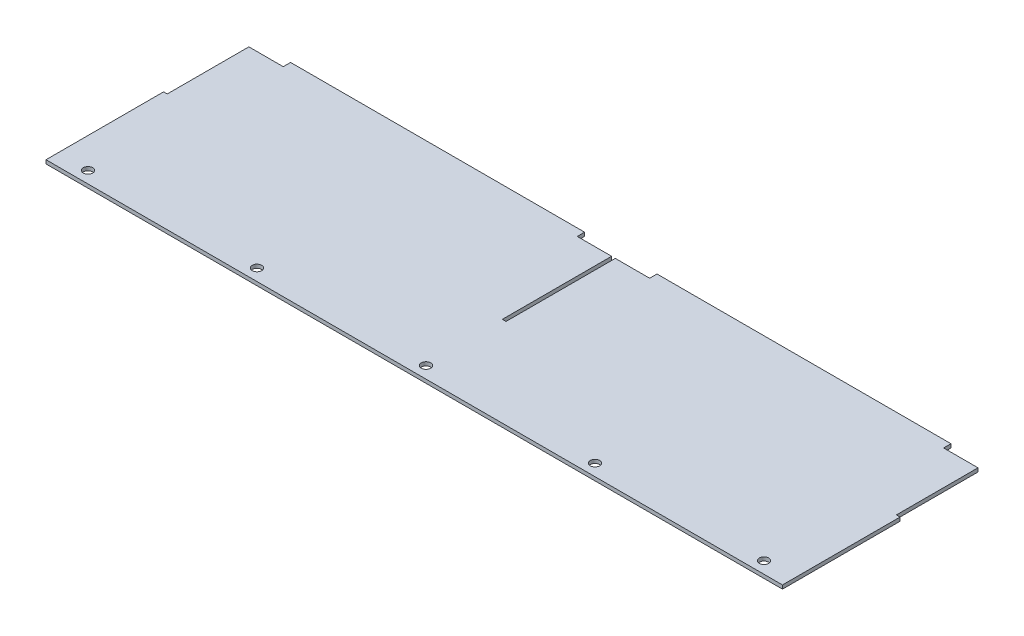
ISO-10303-21;
HEADER;
FILE_DESCRIPTION(('STEP AP214'),'2;1');
FILE_NAME('part.step','',(''),(''),'','','');
FILE_SCHEMA(('AUTOMOTIVE_DESIGN { 1 0 10303 214 1 1 1 1 }'));
ENDSEC;
DATA;
#1=APPLICATION_CONTEXT('core data for automotive mechanical design processes');
#2=APPLICATION_PROTOCOL_DEFINITION('international standard','automotive_design',2000,#1);
#3=PRODUCT_CONTEXT('',#1,'mechanical');
#4=PRODUCT('Part','Part','',(#3));
#5=PRODUCT_RELATED_PRODUCT_CATEGORY('part','',(#4));
#6=PRODUCT_DEFINITION_FORMATION('','',#4);
#7=PRODUCT_DEFINITION_CONTEXT('part definition',#1,'design');
#8=PRODUCT_DEFINITION('design','',#6,#7);
#9=PRODUCT_DEFINITION_SHAPE('','',#8);
#10=(LENGTH_UNIT() NAMED_UNIT(*) SI_UNIT(.MILLI.,.METRE.));
#11=(NAMED_UNIT(*) PLANE_ANGLE_UNIT() SI_UNIT($,.RADIAN.));
#12=(NAMED_UNIT(*) SI_UNIT($,.STERADIAN.) SOLID_ANGLE_UNIT());
#13=UNCERTAINTY_MEASURE_WITH_UNIT(LENGTH_MEASURE(1.E-05),#10,'distance_accuracy_value','');
#14=(GEOMETRIC_REPRESENTATION_CONTEXT(3) GLOBAL_UNCERTAINTY_ASSIGNED_CONTEXT((#13)) GLOBAL_UNIT_ASSIGNED_CONTEXT((#10,
#11,#12)) REPRESENTATION_CONTEXT('',''));
#15=CARTESIAN_POINT('',(0.,0.,0.));
#16=DIRECTION('',(0.,0.,1.));
#17=DIRECTION('',(1.,0.,0.));
#18=AXIS2_PLACEMENT_3D('',#15,#16,#17);
#19=CARTESIAN_POINT('',(0.,3.175,-172.09262));
#20=DIRECTION('',(0.,0.,-1.));
#21=DIRECTION('',(-1.,0.,0.));
#22=AXIS2_PLACEMENT_3D('',#19,#20,#21);
#23=PLANE('',#22);
#24=DIRECTION('',(1.,0.,0.));
#25=VECTOR('',#24,1.);
#26=CARTESIAN_POINT('',(0.,3.175,-172.09262));
#27=LINE('',#26,#25);
#28=CARTESIAN_POINT('',(3.175,3.175,-172.09262));
#29=VERTEX_POINT('',#28);
#30=CARTESIAN_POINT('',(32.858709999998,3.17500000000132,-172.09262));
#31=VERTEX_POINT('',#30);
#32=EDGE_CURVE('E50',#29,#31,#27,.T.);
#33=ORIENTED_EDGE('',*,*,#32,.T.);
#34=DIRECTION('',(0.,1.,0.));
#35=VECTOR('',#34,1.);
#36=CARTESIAN_POINT('',(32.858709999998,3.17500000000132,-172.09262));
#37=LINE('',#36,#35);
#38=CARTESIAN_POINT('',(32.858709999998,9.43689570931383E-13,-172.09262));
#39=VERTEX_POINT('',#38);
#40=EDGE_CURVE('E205',#39,#31,#37,.T.);
#41=ORIENTED_EDGE('',*,*,#40,.F.);
#42=DIRECTION('',(1.,0.,0.));
#43=VECTOR('',#42,1.);
#44=CARTESIAN_POINT('',(0.,0.,-172.09262));
#45=LINE('',#44,#43);
#46=CARTESIAN_POINT('',(3.175,0.,-172.09262));
#47=VERTEX_POINT('',#46);
#48=EDGE_CURVE('E361',#47,#39,#45,.T.);
#49=ORIENTED_EDGE('',*,*,#48,.F.);
#50=DIRECTION('',(0.,1.,0.));
#51=VECTOR('',#50,1.);
#52=CARTESIAN_POINT('',(3.175,3.175,-172.09262));
#53=LINE('',#52,#51);
#54=EDGE_CURVE('E266',#47,#29,#53,.T.);
#55=ORIENTED_EDGE('',*,*,#54,.T.);
#56=EDGE_LOOP('',(#33,#41,#49,#55));
#57=FACE_BOUND('',#56,.T.);
#58=ADVANCED_FACE('F40',(#57),#23,.T.);
#59=CARTESIAN_POINT('',(286.858709999998,0.,-172.09262));
#60=VERTEX_POINT('',#59);
#61=CARTESIAN_POINT('',(316.542419999999,9.43689570931383E-13,-172.09262));
#62=VERTEX_POINT('',#61);
#63=EDGE_CURVE('E364',#60,#62,#45,.T.);
#64=ORIENTED_EDGE('',*,*,#63,.F.);
#65=DIRECTION('',(0.,-1.,0.));
#66=VECTOR('',#65,1.);
#67=CARTESIAN_POINT('',(286.858709999998,3.17500000000132,-172.09262));
#68=LINE('',#67,#66);
#69=CARTESIAN_POINT('',(286.858709999998,3.17500000000132,-172.09262));
#70=VERTEX_POINT('',#69);
#71=EDGE_CURVE('E201',#70,#60,#68,.T.);
#72=ORIENTED_EDGE('',*,*,#71,.F.);
#73=CARTESIAN_POINT('',(316.542419999999,3.17500000000237,-172.09262));
#74=VERTEX_POINT('',#73);
#75=EDGE_CURVE('E356',#70,#74,#27,.T.);
#76=ORIENTED_EDGE('',*,*,#75,.T.);
#77=DIRECTION('',(0.,1.,0.));
#78=VECTOR('',#77,1.);
#79=CARTESIAN_POINT('',(316.542419999999,3.17500000000237,-172.09262));
#80=LINE('',#79,#78);
#81=EDGE_CURVE('E318',#62,#74,#80,.T.);
#82=ORIENTED_EDGE('',*,*,#81,.F.);
#83=EDGE_LOOP('',(#64,#72,#76,#82));
#84=FACE_BOUND('',#83,.T.);
#85=ADVANCED_FACE('F394',(#84),#23,.T.);
#86=CARTESIAN_POINT('',(603.40113,0.,-172.09262));
#87=VERTEX_POINT('',#86);
#88=CARTESIAN_POINT('',(633.08484,0.,-172.09262));
#89=VERTEX_POINT('',#88);
#90=EDGE_CURVE('E360',#87,#89,#45,.T.);
#91=ORIENTED_EDGE('',*,*,#90,.F.);
#92=DIRECTION('',(0.,-1.,0.));
#93=VECTOR('',#92,1.);
#94=CARTESIAN_POINT('',(603.40113,3.17500000000132,-172.09262));
#95=LINE('',#94,#93);
#96=CARTESIAN_POINT('',(603.40113,3.17500000000132,-172.09262));
#97=VERTEX_POINT('',#96);
#98=EDGE_CURVE('E66',#97,#87,#95,.T.);
#99=ORIENTED_EDGE('',*,*,#98,.F.);
#100=CARTESIAN_POINT('',(633.08484,3.175,-172.09262));
#101=VERTEX_POINT('',#100);
#102=EDGE_CURVE('E354',#97,#101,#27,.T.);
#103=ORIENTED_EDGE('',*,*,#102,.T.);
#104=DIRECTION('',(0.,-1.,0.));
#105=VECTOR('',#104,1.);
#106=CARTESIAN_POINT('',(633.08484,3.175,-172.09262));
#107=LINE('',#106,#105);
#108=EDGE_CURVE('E257',#101,#89,#107,.T.);
#109=ORIENTED_EDGE('',*,*,#108,.T.);
#110=EDGE_LOOP('',(#91,#99,#103,#109));
#111=FACE_BOUND('',#110,.T.);
#112=ADVANCED_FACE('F383',(#111),#23,.T.);
#113=CARTESIAN_POINT('',(319.717419999999,3.17500000000132,-172.09262));
#114=VERTEX_POINT('',#113);
#115=CARTESIAN_POINT('',(349.40113,3.17500000000132,-172.09262));
#116=VERTEX_POINT('',#115);
#117=EDGE_CURVE('E357',#114,#116,#27,.T.);
#118=ORIENTED_EDGE('',*,*,#117,.T.);
#119=DIRECTION('',(0.,1.,0.));
#120=VECTOR('',#119,1.);
#121=CARTESIAN_POINT('',(349.40113,3.17500000000132,-172.09262));
#122=LINE('',#121,#120);
#123=CARTESIAN_POINT('',(349.40113,9.43689570931383E-13,-172.09262));
#124=VERTEX_POINT('',#123);
#125=EDGE_CURVE('E211',#124,#116,#122,.T.);
#126=ORIENTED_EDGE('',*,*,#125,.F.);
#127=CARTESIAN_POINT('',(319.717419999999,9.43689570931383E-13,-172.09262));
#128=VERTEX_POINT('',#127);
#129=EDGE_CURVE('E365',#128,#124,#45,.T.);
#130=ORIENTED_EDGE('',*,*,#129,.F.);
#131=DIRECTION('',(0.,-1.,0.));
#132=VECTOR('',#131,1.);
#133=CARTESIAN_POINT('',(319.717419999999,3.17500000000132,-172.09262));
#134=LINE('',#133,#132);
#135=EDGE_CURVE('E288',#114,#128,#134,.T.);
#136=ORIENTED_EDGE('',*,*,#135,.F.);
#137=EDGE_LOOP('',(#118,#126,#130,#136));
#138=FACE_BOUND('',#137,.T.);
#139=ADVANCED_FACE('F409',(#138),#23,.T.);
#140=CARTESIAN_POINT('',(636.25984,3.175,0.));
#141=DIRECTION('',(-1.,0.,0.));
#142=DIRECTION('',(0.,0.,1.));
#143=AXIS2_PLACEMENT_3D('',#140,#141,#142);
#144=PLANE('',#143);
#145=DIRECTION('',(0.,0.,-1.));
#146=VECTOR('',#145,1.);
#147=CARTESIAN_POINT('',(636.25984,3.175,0.));
#148=LINE('',#147,#146);
#149=CARTESIAN_POINT('',(636.25984,3.175,0.));
#150=VERTEX_POINT('',#149);
#151=CARTESIAN_POINT('',(636.25984,3.175,-101.6));
#152=VERTEX_POINT('',#151);
#153=EDGE_CURVE('E11',#150,#152,#148,.T.);
#154=ORIENTED_EDGE('',*,*,#153,.F.);
#155=DIRECTION('',(0.,1.,0.));
#156=VECTOR('',#155,1.);
#157=CARTESIAN_POINT('',(636.25984,0.,0.));
#158=LINE('',#157,#156);
#159=CARTESIAN_POINT('',(636.25984,0.,0.));
#160=VERTEX_POINT('',#159);
#161=EDGE_CURVE('E253',#160,#150,#158,.T.);
#162=ORIENTED_EDGE('',*,*,#161,.F.);
#163=DIRECTION('',(0.,0.,-1.));
#164=VECTOR('',#163,1.);
#165=CARTESIAN_POINT('',(636.25984,0.,0.));
#166=LINE('',#165,#164);
#167=CARTESIAN_POINT('',(636.25984,0.,-101.6));
#168=VERTEX_POINT('',#167);
#169=EDGE_CURVE('E44',#160,#168,#166,.T.);
#170=ORIENTED_EDGE('',*,*,#169,.T.);
#171=DIRECTION('',(0.,1.,0.));
#172=VECTOR('',#171,1.);
#173=CARTESIAN_POINT('',(636.25984,3.175,-101.6));
#174=LINE('',#173,#172);
#175=EDGE_CURVE('E289',#168,#152,#174,.T.);
#176=ORIENTED_EDGE('',*,*,#175,.T.);
#177=EDGE_LOOP('',(#154,#162,#170,#176));
#178=FACE_BOUND('',#177,.T.);
#179=ADVANCED_FACE('F442',(#178),#144,.F.);
#180=CARTESIAN_POINT('',(0.,3.175,0.));
#181=DIRECTION('',(0.,-1.,0.));
#182=DIRECTION('',(0.,0.,-1.));
#183=AXIS2_PLACEMENT_3D('',#180,#181,#182);
#184=PLANE('',#183);
#185=CARTESIAN_POINT('',(26.1071067810834,3.175,-10.1600000000008));
#186=DIRECTION('',(0.,1.,0.));
#187=DIRECTION('',(0.,0.,1.));
#188=AXIS2_PLACEMENT_3D('',#185,#186,#187);
#189=CIRCLE('',#188,4.064);
#190=CARTESIAN_POINT('',(26.1071067810834,3.175,-6.09600000000078));
#191=VERTEX_POINT('',#190);
#192=EDGE_CURVE('E491',#191,#191,#189,.T.);
#193=ORIENTED_EDGE('',*,*,#192,.F.);
#194=EDGE_LOOP('',(#193));
#195=FACE_BOUND('',#194,.T.);
#196=CARTESIAN_POINT('',(172.118513390515,3.175,-10.1600000000008));
#197=DIRECTION('',(0.,1.,0.));
#198=DIRECTION('',(0.,0.,1.));
#199=AXIS2_PLACEMENT_3D('',#196,#197,#198);
#200=CIRCLE('',#199,4.06400000000002);
#201=CARTESIAN_POINT('',(172.118513390515,3.175,-6.09600000000076));
#202=VERTEX_POINT('',#201);
#203=EDGE_CURVE('E526',#202,#202,#200,.T.);
#204=ORIENTED_EDGE('',*,*,#203,.F.);
#205=EDGE_LOOP('',(#204));
#206=FACE_BOUND('',#205,.T.);
#207=CARTESIAN_POINT('',(318.129919999947,3.175,-10.1600000000008));
#208=DIRECTION('',(0.,1.,0.));
#209=DIRECTION('',(0.,0.,1.));
#210=AXIS2_PLACEMENT_3D('',#207,#208,#209);
#211=CIRCLE('',#210,4.06400000000002);
#212=CARTESIAN_POINT('',(318.129919999947,3.175,-6.09600000000076));
#213=VERTEX_POINT('',#212);
#214=EDGE_CURVE('E518',#213,#213,#211,.T.);
#215=ORIENTED_EDGE('',*,*,#214,.F.);
#216=EDGE_LOOP('',(#215));
#217=FACE_BOUND('',#216,.T.);
#218=CARTESIAN_POINT('',(464.141326609379,3.175,-10.1600000000008));
#219=DIRECTION('',(0.,1.,0.));
#220=DIRECTION('',(0.,0.,1.));
#221=AXIS2_PLACEMENT_3D('',#218,#219,#220);
#222=CIRCLE('',#221,4.06400000000002);
#223=CARTESIAN_POINT('',(464.141326609379,3.175,-6.09600000000082));
#224=VERTEX_POINT('',#223);
#225=EDGE_CURVE('E510',#224,#224,#222,.T.);
#226=ORIENTED_EDGE('',*,*,#225,.F.);
#227=EDGE_LOOP('',(#226));
#228=FACE_BOUND('',#227,.T.);
#229=CARTESIAN_POINT('',(610.152733218811,3.175,-10.1600000000008));
#230=DIRECTION('',(0.,1.,0.));
#231=DIRECTION('',(0.,0.,1.));
#232=AXIS2_PLACEMENT_3D('',#229,#230,#231);
#233=CIRCLE('',#232,4.0639999999999);
#234=CARTESIAN_POINT('',(610.152733218811,3.175,-6.09600000000093));
#235=VERTEX_POINT('',#234);
#236=EDGE_CURVE('E502',#235,#235,#233,.T.);
#237=ORIENTED_EDGE('',*,*,#236,.F.);
#238=EDGE_LOOP('',(#237));
#239=FACE_BOUND('',#238,.T.);
#240=DIRECTION('',(0.,0.,-1.));
#241=VECTOR('',#240,1.);
#242=CARTESIAN_POINT('',(0.,3.175,0.));
#243=LINE('',#242,#241);
#244=CARTESIAN_POINT('',(0.,3.175,0.));
#245=VERTEX_POINT('',#244);
#246=CARTESIAN_POINT('',(0.,3.175,-101.6));
#247=VERTEX_POINT('',#246);
#248=EDGE_CURVE('E351',#245,#247,#243,.T.);
#249=ORIENTED_EDGE('',*,*,#248,.F.);
#250=DIRECTION('',(1.,0.,0.));
#251=VECTOR('',#250,1.);
#252=CARTESIAN_POINT('',(0.,3.175,0.));
#253=LINE('',#252,#251);
#254=EDGE_CURVE('E244',#245,#150,#253,.T.);
#255=ORIENTED_EDGE('',*,*,#254,.T.);
#256=ORIENTED_EDGE('',*,*,#153,.T.);
#257=DIRECTION('',(-1.,0.,0.));
#258=VECTOR('',#257,1.);
#259=CARTESIAN_POINT('',(636.25984,3.175,-101.6));
#260=LINE('',#259,#258);
#261=CARTESIAN_POINT('',(633.08484,3.175,-101.6));
#262=VERTEX_POINT('',#261);
#263=EDGE_CURVE('E293',#152,#262,#260,.T.);
#264=ORIENTED_EDGE('',*,*,#263,.T.);
#265=DIRECTION('',(0.,0.,-1.));
#266=VECTOR('',#265,1.);
#267=CARTESIAN_POINT('',(633.08484,3.175,-101.6));
#268=LINE('',#267,#266);
#269=EDGE_CURVE('E281',#262,#101,#268,.T.);
#270=ORIENTED_EDGE('',*,*,#269,.T.);
#271=ORIENTED_EDGE('',*,*,#102,.F.);
#272=DIRECTION('',(0.,0.,1.));
#273=VECTOR('',#272,1.);
#274=CARTESIAN_POINT('',(603.40113,3.17500000000132,-178.44262));
#275=LINE('',#274,#273);
#276=CARTESIAN_POINT('',(603.40113,3.17500000000132,-178.44262));
#277=VERTEX_POINT('',#276);
#278=EDGE_CURVE('E228',#277,#97,#275,.T.);
#279=ORIENTED_EDGE('',*,*,#278,.F.);
#280=DIRECTION('',(1.,0.,0.));
#281=VECTOR('',#280,1.);
#282=CARTESIAN_POINT('',(603.40113,3.17500000000132,-178.44262));
#283=LINE('',#282,#281);
#284=CARTESIAN_POINT('',(349.40113,3.17500000000132,-178.44262));
#285=VERTEX_POINT('',#284);
#286=EDGE_CURVE('E226',#285,#277,#283,.T.);
#287=ORIENTED_EDGE('',*,*,#286,.F.);
#288=DIRECTION('',(0.,0.,1.));
#289=VECTOR('',#288,1.);
#290=CARTESIAN_POINT('',(349.40113,3.17500000000132,-178.44262));
#291=LINE('',#290,#289);
#292=EDGE_CURVE('E234',#285,#116,#291,.T.);
#293=ORIENTED_EDGE('',*,*,#292,.T.);
#294=ORIENTED_EDGE('',*,*,#117,.F.);
#295=DIRECTION('',(0.,0.,-1.));
#296=VECTOR('',#295,1.);
#297=CARTESIAN_POINT('',(319.717419999999,3.17500000000132,-77.72654));
#298=LINE('',#297,#296);
#299=CARTESIAN_POINT('',(319.717419999999,3.17500000000132,-77.72654));
#300=VERTEX_POINT('',#299);
#301=EDGE_CURVE('E336',#300,#114,#298,.T.);
#302=ORIENTED_EDGE('',*,*,#301,.F.);
#303=DIRECTION('',(1.,-3.32192716029536E-13,0.));
#304=VECTOR('',#303,1.);
#305=CARTESIAN_POINT('',(319.717419999999,3.17500000000132,-77.72654));
#306=LINE('',#305,#304);
#307=CARTESIAN_POINT('',(316.542419999999,3.17500000000237,-77.72654));
#308=VERTEX_POINT('',#307);
#309=EDGE_CURVE('E326',#308,#300,#306,.T.);
#310=ORIENTED_EDGE('',*,*,#309,.F.);
#311=DIRECTION('',(0.,0.,-1.));
#312=VECTOR('',#311,1.);
#313=CARTESIAN_POINT('',(316.542419999999,3.17500000000237,-77.72654));
#314=LINE('',#313,#312);
#315=EDGE_CURVE('E340',#308,#74,#314,.T.);
#316=ORIENTED_EDGE('',*,*,#315,.T.);
#317=ORIENTED_EDGE('',*,*,#75,.F.);
#318=DIRECTION('',(0.,0.,1.));
#319=VECTOR('',#318,1.);
#320=CARTESIAN_POINT('',(286.858709999998,3.17500000000132,-178.44262));
#321=LINE('',#320,#319);
#322=CARTESIAN_POINT('',(286.858709999998,3.17500000000132,-178.44262));
#323=VERTEX_POINT('',#322);
#324=EDGE_CURVE('E188',#323,#70,#321,.T.);
#325=ORIENTED_EDGE('',*,*,#324,.F.);
#326=DIRECTION('',(1.,0.,0.));
#327=VECTOR('',#326,1.);
#328=CARTESIAN_POINT('',(32.858709999998,3.17500000000132,-178.44262));
#329=LINE('',#328,#327);
#330=CARTESIAN_POINT('',(32.858709999998,3.17500000000132,-178.44262));
#331=VERTEX_POINT('',#330);
#332=EDGE_CURVE('E180',#331,#323,#329,.T.);
#333=ORIENTED_EDGE('',*,*,#332,.F.);
#334=DIRECTION('',(0.,0.,1.));
#335=VECTOR('',#334,1.);
#336=CARTESIAN_POINT('',(32.858709999998,3.17500000000132,-178.44262));
#337=LINE('',#336,#335);
#338=EDGE_CURVE('E185',#331,#31,#337,.T.);
#339=ORIENTED_EDGE('',*,*,#338,.T.);
#340=ORIENTED_EDGE('',*,*,#32,.F.);
#341=DIRECTION('',(0.,0.,-1.));
#342=VECTOR('',#341,1.);
#343=CARTESIAN_POINT('',(3.175,3.175,-101.6));
#344=LINE('',#343,#342);
#345=CARTESIAN_POINT('',(3.175,3.175,-101.6));
#346=VERTEX_POINT('',#345);
#347=EDGE_CURVE('E277',#346,#29,#344,.T.);
#348=ORIENTED_EDGE('',*,*,#347,.F.);
#349=DIRECTION('',(-1.,0.,0.));
#350=VECTOR('',#349,1.);
#351=CARTESIAN_POINT('',(0.,3.175,-101.6));
#352=LINE('',#351,#350);
#353=EDGE_CURVE('E273',#346,#247,#352,.T.);
#354=ORIENTED_EDGE('',*,*,#353,.T.);
#355=EDGE_LOOP('',(#249,#255,#256,#264,#270,#271,#279,#287,#293,#294,#302,#310,#316,#317,#325,
#333,#339,#340,#348,#354));
#356=FACE_BOUND('',#355,.T.);
#357=ADVANCED_FACE('F182',(#195,#206,#217,#228,#239,#356),#184,.F.);
#358=CARTESIAN_POINT('',(0.,0.,0.));
#359=DIRECTION('',(0.,-1.,0.));
#360=DIRECTION('',(0.,0.,-1.));
#361=AXIS2_PLACEMENT_3D('',#358,#359,#360);
#362=PLANE('',#361);
#363=CARTESIAN_POINT('',(26.1071067810834,0.,-10.1600000000008));
#364=DIRECTION('',(0.,1.,0.));
#365=DIRECTION('',(0.,0.,1.));
#366=AXIS2_PLACEMENT_3D('',#363,#364,#365);
#367=CIRCLE('',#366,4.064);
#368=CARTESIAN_POINT('',(26.1071067810834,0.,-6.09600000000078));
#369=VERTEX_POINT('',#368);
#370=EDGE_CURVE('E485',#369,#369,#367,.T.);
#371=ORIENTED_EDGE('',*,*,#370,.T.);
#372=EDGE_LOOP('',(#371));
#373=FACE_BOUND('',#372,.T.);
#374=CARTESIAN_POINT('',(172.118513390515,0.,-10.1600000000008));
#375=DIRECTION('',(0.,1.,0.));
#376=DIRECTION('',(0.,0.,1.));
#377=AXIS2_PLACEMENT_3D('',#374,#375,#376);
#378=CIRCLE('',#377,4.06400000000002);
#379=CARTESIAN_POINT('',(172.118513390515,0.,-6.09600000000076));
#380=VERTEX_POINT('',#379);
#381=EDGE_CURVE('E530',#380,#380,#378,.T.);
#382=ORIENTED_EDGE('',*,*,#381,.T.);
#383=EDGE_LOOP('',(#382));
#384=FACE_BOUND('',#383,.T.);
#385=CARTESIAN_POINT('',(318.129919999947,0.,-10.1600000000008));
#386=DIRECTION('',(0.,1.,0.));
#387=DIRECTION('',(0.,0.,1.));
#388=AXIS2_PLACEMENT_3D('',#385,#386,#387);
#389=CIRCLE('',#388,4.06400000000002);
#390=CARTESIAN_POINT('',(318.129919999947,0.,-6.09600000000076));
#391=VERTEX_POINT('',#390);
#392=EDGE_CURVE('E522',#391,#391,#389,.T.);
#393=ORIENTED_EDGE('',*,*,#392,.T.);
#394=EDGE_LOOP('',(#393));
#395=FACE_BOUND('',#394,.T.);
#396=CARTESIAN_POINT('',(464.141326609379,0.,-10.1600000000008));
#397=DIRECTION('',(0.,1.,0.));
#398=DIRECTION('',(0.,0.,1.));
#399=AXIS2_PLACEMENT_3D('',#396,#397,#398);
#400=CIRCLE('',#399,4.06400000000002);
#401=CARTESIAN_POINT('',(464.141326609379,0.,-6.09600000000082));
#402=VERTEX_POINT('',#401);
#403=EDGE_CURVE('E514',#402,#402,#400,.T.);
#404=ORIENTED_EDGE('',*,*,#403,.T.);
#405=EDGE_LOOP('',(#404));
#406=FACE_BOUND('',#405,.T.);
#407=CARTESIAN_POINT('',(610.152733218811,0.,-10.1600000000008));
#408=DIRECTION('',(0.,1.,0.));
#409=DIRECTION('',(0.,0.,1.));
#410=AXIS2_PLACEMENT_3D('',#407,#408,#409);
#411=CIRCLE('',#410,4.0639999999999);
#412=CARTESIAN_POINT('',(610.152733218811,0.,-6.09600000000093));
#413=VERTEX_POINT('',#412);
#414=EDGE_CURVE('E506',#413,#413,#411,.T.);
#415=ORIENTED_EDGE('',*,*,#414,.T.);
#416=EDGE_LOOP('',(#415));
#417=FACE_BOUND('',#416,.T.);
#418=ORIENTED_EDGE('',*,*,#169,.F.);
#419=DIRECTION('',(1.,0.,0.));
#420=VECTOR('',#419,1.);
#421=CARTESIAN_POINT('',(0.,0.,0.));
#422=LINE('',#421,#420);
#423=CARTESIAN_POINT('',(0.,0.,0.));
#424=VERTEX_POINT('',#423);
#425=EDGE_CURVE('E245',#424,#160,#422,.T.);
#426=ORIENTED_EDGE('',*,*,#425,.F.);
#427=DIRECTION('',(0.,0.,-1.));
#428=VECTOR('',#427,1.);
#429=CARTESIAN_POINT('',(0.,0.,0.));
#430=LINE('',#429,#428);
#431=CARTESIAN_POINT('',(0.,0.,-101.6));
#432=VERTEX_POINT('',#431);
#433=EDGE_CURVE('E339',#424,#432,#430,.T.);
#434=ORIENTED_EDGE('',*,*,#433,.T.);
#435=DIRECTION('',(1.,0.,0.));
#436=VECTOR('',#435,1.);
#437=CARTESIAN_POINT('',(0.,0.,-101.6));
#438=LINE('',#437,#436);
#439=CARTESIAN_POINT('',(3.175,0.,-101.6));
#440=VERTEX_POINT('',#439);
#441=EDGE_CURVE('E265',#432,#440,#438,.T.);
#442=ORIENTED_EDGE('',*,*,#441,.T.);
#443=DIRECTION('',(0.,0.,-1.));
#444=VECTOR('',#443,1.);
#445=CARTESIAN_POINT('',(3.175,0.,-101.6));
#446=LINE('',#445,#444);
#447=EDGE_CURVE('E284',#440,#47,#446,.T.);
#448=ORIENTED_EDGE('',*,*,#447,.T.);
#449=ORIENTED_EDGE('',*,*,#48,.T.);
#450=DIRECTION('',(0.,0.,1.));
#451=VECTOR('',#450,1.);
#452=CARTESIAN_POINT('',(32.858709999998,9.43689570931383E-13,-178.44262));
#453=LINE('',#452,#451);
#454=CARTESIAN_POINT('',(32.858709999998,9.43689570931383E-13,-178.44262));
#455=VERTEX_POINT('',#454);
#456=EDGE_CURVE('E496',#455,#39,#453,.T.);
#457=ORIENTED_EDGE('',*,*,#456,.F.);
#458=DIRECTION('',(-1.,0.,0.));
#459=VECTOR('',#458,1.);
#460=CARTESIAN_POINT('',(32.858709999998,9.43689570931383E-13,-178.44262));
#461=LINE('',#460,#459);
#462=CARTESIAN_POINT('',(286.858709999998,9.43689570931383E-13,-178.44262));
#463=VERTEX_POINT('',#462);
#464=EDGE_CURVE('E197',#463,#455,#461,.T.);
#465=ORIENTED_EDGE('',*,*,#464,.F.);
#466=DIRECTION('',(0.,0.,1.));
#467=VECTOR('',#466,1.);
#468=CARTESIAN_POINT('',(286.858709999998,9.43689570931383E-13,-178.44262));
#469=LINE('',#468,#467);
#470=EDGE_CURVE('E58',#463,#60,#469,.T.);
#471=ORIENTED_EDGE('',*,*,#470,.T.);
#472=ORIENTED_EDGE('',*,*,#63,.T.);
#473=DIRECTION('',(0.,0.,-1.));
#474=VECTOR('',#473,1.);
#475=CARTESIAN_POINT('',(316.542419999999,9.43689570931383E-13,-77.72654));
#476=LINE('',#475,#474);
#477=CARTESIAN_POINT('',(316.542419999999,9.43689570931383E-13,-77.72654));
#478=VERTEX_POINT('',#477);
#479=EDGE_CURVE('E344',#478,#62,#476,.T.);
#480=ORIENTED_EDGE('',*,*,#479,.F.);
#481=DIRECTION('',(-1.,0.,0.));
#482=VECTOR('',#481,1.);
#483=CARTESIAN_POINT('',(319.717419999999,9.43689570931383E-13,-77.72654));
#484=LINE('',#483,#482);
#485=CARTESIAN_POINT('',(319.717419999999,0.,-77.72654));
#486=VERTEX_POINT('',#485);
#487=EDGE_CURVE('E317',#486,#478,#484,.T.);
#488=ORIENTED_EDGE('',*,*,#487,.F.);
#489=DIRECTION('',(0.,0.,-1.));
#490=VECTOR('',#489,1.);
#491=CARTESIAN_POINT('',(319.717419999999,9.43689570931383E-13,-77.72654));
#492=LINE('',#491,#490);
#493=EDGE_CURVE('E330',#486,#128,#492,.T.);
#494=ORIENTED_EDGE('',*,*,#493,.T.);
#495=ORIENTED_EDGE('',*,*,#129,.T.);
#496=DIRECTION('',(0.,0.,1.));
#497=VECTOR('',#496,1.);
#498=CARTESIAN_POINT('',(349.40113,9.43689570931383E-13,-178.44262));
#499=LINE('',#498,#497);
#500=CARTESIAN_POINT('',(349.40113,9.43689570931383E-13,-178.44262));
#501=VERTEX_POINT('',#500);
#502=EDGE_CURVE('E238',#501,#124,#499,.T.);
#503=ORIENTED_EDGE('',*,*,#502,.F.);
#504=DIRECTION('',(-1.,0.,0.));
#505=VECTOR('',#504,1.);
#506=CARTESIAN_POINT('',(603.40113,9.43689570931383E-13,-178.44262));
#507=LINE('',#506,#505);
#508=CARTESIAN_POINT('',(603.40113,9.43689570931383E-13,-178.44262));
#509=VERTEX_POINT('',#508);
#510=EDGE_CURVE('E220',#509,#501,#507,.T.);
#511=ORIENTED_EDGE('',*,*,#510,.F.);
#512=DIRECTION('',(0.,0.,1.));
#513=VECTOR('',#512,1.);
#514=CARTESIAN_POINT('',(603.40113,9.43689570931383E-13,-178.44262));
#515=LINE('',#514,#513);
#516=EDGE_CURVE('E241',#509,#87,#515,.T.);
#517=ORIENTED_EDGE('',*,*,#516,.T.);
#518=ORIENTED_EDGE('',*,*,#90,.T.);
#519=DIRECTION('',(0.,0.,-1.));
#520=VECTOR('',#519,1.);
#521=CARTESIAN_POINT('',(633.08484,0.,-101.6));
#522=LINE('',#521,#520);
#523=CARTESIAN_POINT('',(633.08484,0.,-101.6));
#524=VERTEX_POINT('',#523);
#525=EDGE_CURVE('E304',#524,#89,#522,.T.);
#526=ORIENTED_EDGE('',*,*,#525,.F.);
#527=DIRECTION('',(1.,0.,0.));
#528=VECTOR('',#527,1.);
#529=CARTESIAN_POINT('',(636.25984,0.,-101.6));
#530=LINE('',#529,#528);
#531=EDGE_CURVE('E300',#524,#168,#530,.T.);
#532=ORIENTED_EDGE('',*,*,#531,.T.);
#533=EDGE_LOOP('',(#418,#426,#434,#442,#448,#449,#457,#465,#471,#472,#480,#488,#494,#495,#503,
#511,#517,#518,#526,#532));
#534=FACE_BOUND('',#533,.T.);
#535=ADVANCED_FACE('F376',(#373,#384,#395,#406,#417,#534),#362,.T.);
#536=CARTESIAN_POINT('',(0.,3.175,0.));
#537=DIRECTION('',(-1.,0.,0.));
#538=DIRECTION('',(0.,0.,1.));
#539=AXIS2_PLACEMENT_3D('',#536,#537,#538);
#540=PLANE('',#539);
#541=ORIENTED_EDGE('',*,*,#433,.F.);
#542=DIRECTION('',(0.,1.,0.));
#543=VECTOR('',#542,1.);
#544=CARTESIAN_POINT('',(0.,0.,0.));
#545=LINE('',#544,#543);
#546=EDGE_CURVE('E249',#424,#245,#545,.T.);
#547=ORIENTED_EDGE('',*,*,#546,.T.);
#548=ORIENTED_EDGE('',*,*,#248,.T.);
#549=DIRECTION('',(0.,-1.,0.));
#550=VECTOR('',#549,1.);
#551=CARTESIAN_POINT('',(0.,3.175,-101.6));
#552=LINE('',#551,#550);
#553=EDGE_CURVE('E261',#247,#432,#552,.T.);
#554=ORIENTED_EDGE('',*,*,#553,.T.);
#555=EDGE_LOOP('',(#541,#547,#548,#554));
#556=FACE_BOUND('',#555,.T.);
#557=ADVANCED_FACE('F42',(#556),#540,.T.);
#558=CARTESIAN_POINT('',(319.717419999999,3.17500000000132,-77.72654));
#559=DIRECTION('',(1.,0.,0.));
#560=DIRECTION('',(0.,0.,-1.));
#561=AXIS2_PLACEMENT_3D('',#558,#559,#560);
#562=PLANE('',#561);
#563=ORIENTED_EDGE('',*,*,#135,.T.);
#564=ORIENTED_EDGE('',*,*,#493,.F.);
#565=DIRECTION('',(0.,-1.,0.));
#566=VECTOR('',#565,1.);
#567=CARTESIAN_POINT('',(319.717419999999,3.17500000000132,-77.72654));
#568=LINE('',#567,#566);
#569=EDGE_CURVE('E314',#300,#486,#568,.T.);
#570=ORIENTED_EDGE('',*,*,#569,.F.);
#571=ORIENTED_EDGE('',*,*,#301,.T.);
#572=EDGE_LOOP('',(#563,#564,#570,#571));
#573=FACE_BOUND('',#572,.T.);
#574=ADVANCED_FACE('F458',(#573),#562,.F.);
#575=CARTESIAN_POINT('',(316.542419999999,3.17500000000237,-77.72654));
#576=DIRECTION('',(-1.,0.,0.));
#577=DIRECTION('',(0.,0.,1.));
#578=AXIS2_PLACEMENT_3D('',#575,#576,#577);
#579=PLANE('',#578);
#580=ORIENTED_EDGE('',*,*,#81,.T.);
#581=ORIENTED_EDGE('',*,*,#315,.F.);
#582=DIRECTION('',(0.,1.,0.));
#583=VECTOR('',#582,1.);
#584=CARTESIAN_POINT('',(316.542419999999,3.17500000000237,-77.72654));
#585=LINE('',#584,#583);
#586=EDGE_CURVE('E322',#478,#308,#585,.T.);
#587=ORIENTED_EDGE('',*,*,#586,.F.);
#588=ORIENTED_EDGE('',*,*,#479,.T.);
#589=EDGE_LOOP('',(#580,#581,#587,#588));
#590=FACE_BOUND('',#589,.T.);
#591=ADVANCED_FACE('F396',(#590),#579,.F.);
#592=CARTESIAN_POINT('',(0.,0.,-77.72654));
#593=DIRECTION('',(0.,0.,-1.));
#594=DIRECTION('',(-1.,0.,0.));
#595=AXIS2_PLACEMENT_3D('',#592,#593,#594);
#596=PLANE('',#595);
#597=ORIENTED_EDGE('',*,*,#569,.T.);
#598=ORIENTED_EDGE('',*,*,#487,.T.);
#599=ORIENTED_EDGE('',*,*,#586,.T.);
#600=ORIENTED_EDGE('',*,*,#309,.T.);
#601=EDGE_LOOP('',(#597,#598,#599,#600));
#602=FACE_BOUND('',#601,.T.);
#603=ADVANCED_FACE('F402',(#602),#596,.T.);
#604=CARTESIAN_POINT('',(633.08484,3.175,-101.6));
#605=DIRECTION('',(1.,0.,0.));
#606=DIRECTION('',(0.,0.,-1.));
#607=AXIS2_PLACEMENT_3D('',#604,#605,#606);
#608=PLANE('',#607);
#609=ORIENTED_EDGE('',*,*,#108,.F.);
#610=ORIENTED_EDGE('',*,*,#269,.F.);
#611=DIRECTION('',(0.,-1.,0.));
#612=VECTOR('',#611,1.);
#613=CARTESIAN_POINT('',(633.08484,3.175,-101.6));
#614=LINE('',#613,#612);
#615=EDGE_CURVE('E297',#262,#524,#614,.T.);
#616=ORIENTED_EDGE('',*,*,#615,.T.);
#617=ORIENTED_EDGE('',*,*,#525,.T.);
#618=EDGE_LOOP('',(#609,#610,#616,#617));
#619=FACE_BOUND('',#618,.T.);
#620=ADVANCED_FACE('F380',(#619),#608,.T.);
#621=CARTESIAN_POINT('',(0.,0.,-101.6));
#622=DIRECTION('',(0.,0.,-1.));
#623=DIRECTION('',(-1.,0.,0.));
#624=AXIS2_PLACEMENT_3D('',#621,#622,#623);
#625=PLANE('',#624);
#626=ORIENTED_EDGE('',*,*,#175,.F.);
#627=ORIENTED_EDGE('',*,*,#531,.F.);
#628=ORIENTED_EDGE('',*,*,#615,.F.);
#629=ORIENTED_EDGE('',*,*,#263,.F.);
#630=EDGE_LOOP('',(#626,#627,#628,#629));
#631=FACE_BOUND('',#630,.T.);
#632=ADVANCED_FACE('F467',(#631),#625,.T.);
#633=CARTESIAN_POINT('',(3.175,3.175,-101.6));
#634=DIRECTION('',(-1.,0.,0.));
#635=DIRECTION('',(0.,-1.,0.));
#636=AXIS2_PLACEMENT_3D('',#633,#634,#635);
#637=PLANE('',#636);
#638=ORIENTED_EDGE('',*,*,#54,.F.);
#639=ORIENTED_EDGE('',*,*,#447,.F.);
#640=DIRECTION('',(0.,1.,0.));
#641=VECTOR('',#640,1.);
#642=CARTESIAN_POINT('',(3.175,3.175,-101.6));
#643=LINE('',#642,#641);
#644=EDGE_CURVE('E270',#440,#346,#643,.T.);
#645=ORIENTED_EDGE('',*,*,#644,.T.);
#646=ORIENTED_EDGE('',*,*,#347,.T.);
#647=EDGE_LOOP('',(#638,#639,#645,#646));
#648=FACE_BOUND('',#647,.T.);
#649=ADVANCED_FACE('F470',(#648),#637,.T.);
#650=CARTESIAN_POINT('',(0.,0.,-101.6));
#651=DIRECTION('',(0.,0.,1.));
#652=DIRECTION('',(1.,0.,0.));
#653=AXIS2_PLACEMENT_3D('',#650,#651,#652);
#654=PLANE('',#653);
#655=ORIENTED_EDGE('',*,*,#553,.F.);
#656=ORIENTED_EDGE('',*,*,#353,.F.);
#657=ORIENTED_EDGE('',*,*,#644,.F.);
#658=ORIENTED_EDGE('',*,*,#441,.F.);
#659=EDGE_LOOP('',(#655,#656,#657,#658));
#660=FACE_BOUND('',#659,.T.);
#661=ADVANCED_FACE('F428',(#660),#654,.F.);
#662=CARTESIAN_POINT('',(0.,0.,0.));
#663=DIRECTION('',(0.,0.,1.));
#664=DIRECTION('',(1.,0.,0.));
#665=AXIS2_PLACEMENT_3D('',#662,#663,#664);
#666=PLANE('',#665);
#667=ORIENTED_EDGE('',*,*,#254,.F.);
#668=ORIENTED_EDGE('',*,*,#546,.F.);
#669=ORIENTED_EDGE('',*,*,#425,.T.);
#670=ORIENTED_EDGE('',*,*,#161,.T.);
#671=EDGE_LOOP('',(#667,#668,#669,#670));
#672=FACE_BOUND('',#671,.T.);
#673=ADVANCED_FACE('F420',(#672),#666,.T.);
#674=CARTESIAN_POINT('',(603.40113,3.17500000000132,-178.44262));
#675=DIRECTION('',(-1.,0.,0.));
#676=DIRECTION('',(0.,0.,1.));
#677=AXIS2_PLACEMENT_3D('',#674,#675,#676);
#678=PLANE('',#677);
#679=ORIENTED_EDGE('',*,*,#98,.T.);
#680=ORIENTED_EDGE('',*,*,#516,.F.);
#681=DIRECTION('',(0.,-1.,0.));
#682=VECTOR('',#681,1.);
#683=CARTESIAN_POINT('',(603.40113,3.17500000000132,-178.44262));
#684=LINE('',#683,#682);
#685=EDGE_CURVE('E216',#277,#509,#684,.T.);
#686=ORIENTED_EDGE('',*,*,#685,.F.);
#687=ORIENTED_EDGE('',*,*,#278,.T.);
#688=EDGE_LOOP('',(#679,#680,#686,#687));
#689=FACE_BOUND('',#688,.T.);
#690=ADVANCED_FACE('F418',(#689),#678,.F.);
#691=CARTESIAN_POINT('',(349.40113,3.17500000000132,-178.44262));
#692=DIRECTION('',(1.,0.,0.));
#693=DIRECTION('',(0.,0.,-1.));
#694=AXIS2_PLACEMENT_3D('',#691,#692,#693);
#695=PLANE('',#694);
#696=ORIENTED_EDGE('',*,*,#125,.T.);
#697=ORIENTED_EDGE('',*,*,#292,.F.);
#698=DIRECTION('',(0.,1.,0.));
#699=VECTOR('',#698,1.);
#700=CARTESIAN_POINT('',(349.40113,3.17500000000132,-178.44262));
#701=LINE('',#700,#699);
#702=EDGE_CURVE('E223',#501,#285,#701,.T.);
#703=ORIENTED_EDGE('',*,*,#702,.F.);
#704=ORIENTED_EDGE('',*,*,#502,.T.);
#705=EDGE_LOOP('',(#696,#697,#703,#704));
#706=FACE_BOUND('',#705,.T.);
#707=ADVANCED_FACE('F412',(#706),#695,.F.);
#708=CARTESIAN_POINT('',(0.,0.,-178.44262));
#709=DIRECTION('',(0.,0.,-1.));
#710=DIRECTION('',(-1.,0.,0.));
#711=AXIS2_PLACEMENT_3D('',#708,#709,#710);
#712=PLANE('',#711);
#713=ORIENTED_EDGE('',*,*,#685,.T.);
#714=ORIENTED_EDGE('',*,*,#510,.T.);
#715=ORIENTED_EDGE('',*,*,#702,.T.);
#716=ORIENTED_EDGE('',*,*,#286,.T.);
#717=EDGE_LOOP('',(#713,#714,#715,#716));
#718=FACE_BOUND('',#717,.T.);
#719=ADVANCED_FACE('F417',(#718),#712,.T.);
#720=CARTESIAN_POINT('',(32.858709999998,3.17500000000132,-178.44262));
#721=DIRECTION('',(1.,0.,0.));
#722=DIRECTION('',(0.,0.,-1.));
#723=AXIS2_PLACEMENT_3D('',#720,#721,#722);
#724=PLANE('',#723);
#725=ORIENTED_EDGE('',*,*,#40,.T.);
#726=ORIENTED_EDGE('',*,*,#338,.F.);
#727=DIRECTION('',(0.,1.,0.));
#728=VECTOR('',#727,1.);
#729=CARTESIAN_POINT('',(32.858709999998,3.17500000000132,-178.44262));
#730=LINE('',#729,#728);
#731=EDGE_CURVE('E193',#455,#331,#730,.T.);
#732=ORIENTED_EDGE('',*,*,#731,.F.);
#733=ORIENTED_EDGE('',*,*,#456,.T.);
#734=EDGE_LOOP('',(#725,#726,#732,#733));
#735=FACE_BOUND('',#734,.T.);
#736=ADVANCED_FACE('F203',(#735),#724,.F.);
#737=CARTESIAN_POINT('',(286.858709999998,3.17500000000132,-178.44262));
#738=DIRECTION('',(-1.,0.,0.));
#739=DIRECTION('',(0.,0.,1.));
#740=AXIS2_PLACEMENT_3D('',#737,#738,#739);
#741=PLANE('',#740);
#742=ORIENTED_EDGE('',*,*,#71,.T.);
#743=ORIENTED_EDGE('',*,*,#470,.F.);
#744=DIRECTION('',(0.,-1.,0.));
#745=VECTOR('',#744,1.);
#746=CARTESIAN_POINT('',(286.858709999998,3.17500000000132,-178.44262));
#747=LINE('',#746,#745);
#748=EDGE_CURVE('E192',#323,#463,#747,.T.);
#749=ORIENTED_EDGE('',*,*,#748,.F.);
#750=ORIENTED_EDGE('',*,*,#324,.T.);
#751=EDGE_LOOP('',(#742,#743,#749,#750));
#752=FACE_BOUND('',#751,.T.);
#753=ADVANCED_FACE('F560',(#752),#741,.F.);
#754=CARTESIAN_POINT('',(0.,0.,-178.44262));
#755=DIRECTION('',(0.,0.,1.));
#756=DIRECTION('',(1.,0.,0.));
#757=AXIS2_PLACEMENT_3D('',#754,#755,#756);
#758=PLANE('',#757);
#759=ORIENTED_EDGE('',*,*,#731,.T.);
#760=ORIENTED_EDGE('',*,*,#332,.T.);
#761=ORIENTED_EDGE('',*,*,#748,.T.);
#762=ORIENTED_EDGE('',*,*,#464,.T.);
#763=EDGE_LOOP('',(#759,#760,#761,#762));
#764=FACE_BOUND('',#763,.T.);
#765=ADVANCED_FACE('F196',(#764),#758,.F.);
#766=CARTESIAN_POINT('',(610.152733218811,0.,-10.1600000000008));
#767=DIRECTION('',(0.,1.,0.));
#768=DIRECTION('',(0.,0.,1.));
#769=AXIS2_PLACEMENT_3D('',#766,#767,#768);
#770=CYLINDRICAL_SURFACE('',#769,4.0639999999999);
#771=ORIENTED_EDGE('',*,*,#414,.F.);
#772=EDGE_LOOP('',(#771));
#773=FACE_BOUND('',#772,.T.);
#774=ORIENTED_EDGE('',*,*,#236,.T.);
#775=EDGE_LOOP('',(#774));
#776=FACE_BOUND('',#775,.T.);
#777=ADVANCED_FACE('F548',(#773,#776),#770,.F.);
#778=CARTESIAN_POINT('',(464.141326609379,0.,-10.1600000000008));
#779=DIRECTION('',(0.,1.,0.));
#780=DIRECTION('',(0.,0.,1.));
#781=AXIS2_PLACEMENT_3D('',#778,#779,#780);
#782=CYLINDRICAL_SURFACE('',#781,4.06400000000002);
#783=ORIENTED_EDGE('',*,*,#403,.F.);
#784=EDGE_LOOP('',(#783));
#785=FACE_BOUND('',#784,.T.);
#786=ORIENTED_EDGE('',*,*,#225,.T.);
#787=EDGE_LOOP('',(#786));
#788=FACE_BOUND('',#787,.T.);
#789=ADVANCED_FACE('F550',(#785,#788),#782,.F.);
#790=CARTESIAN_POINT('',(318.129919999947,0.,-10.1600000000008));
#791=DIRECTION('',(0.,1.,0.));
#792=DIRECTION('',(0.,0.,1.));
#793=AXIS2_PLACEMENT_3D('',#790,#791,#792);
#794=CYLINDRICAL_SURFACE('',#793,4.06400000000002);
#795=ORIENTED_EDGE('',*,*,#392,.F.);
#796=EDGE_LOOP('',(#795));
#797=FACE_BOUND('',#796,.T.);
#798=ORIENTED_EDGE('',*,*,#214,.T.);
#799=EDGE_LOOP('',(#798));
#800=FACE_BOUND('',#799,.T.);
#801=ADVANCED_FACE('F557',(#797,#800),#794,.F.);
#802=CARTESIAN_POINT('',(172.118513390515,0.,-10.1600000000008));
#803=DIRECTION('',(0.,1.,0.));
#804=DIRECTION('',(0.,0.,1.));
#805=AXIS2_PLACEMENT_3D('',#802,#803,#804);
#806=CYLINDRICAL_SURFACE('',#805,4.06400000000002);
#807=ORIENTED_EDGE('',*,*,#381,.F.);
#808=EDGE_LOOP('',(#807));
#809=FACE_BOUND('',#808,.T.);
#810=ORIENTED_EDGE('',*,*,#203,.T.);
#811=EDGE_LOOP('',(#810));
#812=FACE_BOUND('',#811,.T.);
#813=ADVANCED_FACE('F614',(#809,#812),#806,.F.);
#814=CARTESIAN_POINT('',(26.1071067810834,0.,-10.1600000000008));
#815=DIRECTION('',(0.,1.,0.));
#816=DIRECTION('',(0.,0.,1.));
#817=AXIS2_PLACEMENT_3D('',#814,#815,#816);
#818=CYLINDRICAL_SURFACE('',#817,4.064);
#819=ORIENTED_EDGE('',*,*,#370,.F.);
#820=EDGE_LOOP('',(#819));
#821=FACE_BOUND('',#820,.T.);
#822=ORIENTED_EDGE('',*,*,#192,.T.);
#823=EDGE_LOOP('',(#822));
#824=FACE_BOUND('',#823,.T.);
#825=ADVANCED_FACE('F538',(#821,#824),#818,.F.);
#826=CLOSED_SHELL('',(#58,#85,#112,#139,#179,#357,#535,#557,#574,#591,#603,#620,#632,#649,#661,
#673,#690,#707,#719,#736,#753,#765,#777,#789,#801,#813,#825));
#827=MANIFOLD_SOLID_BREP('B2',#826);
#828=ADVANCED_BREP_SHAPE_REPRESENTATION('',(#18,#827),#14);
#829=SHAPE_DEFINITION_REPRESENTATION(#9,#828);
ENDSEC;
END-ISO-10303-21;
